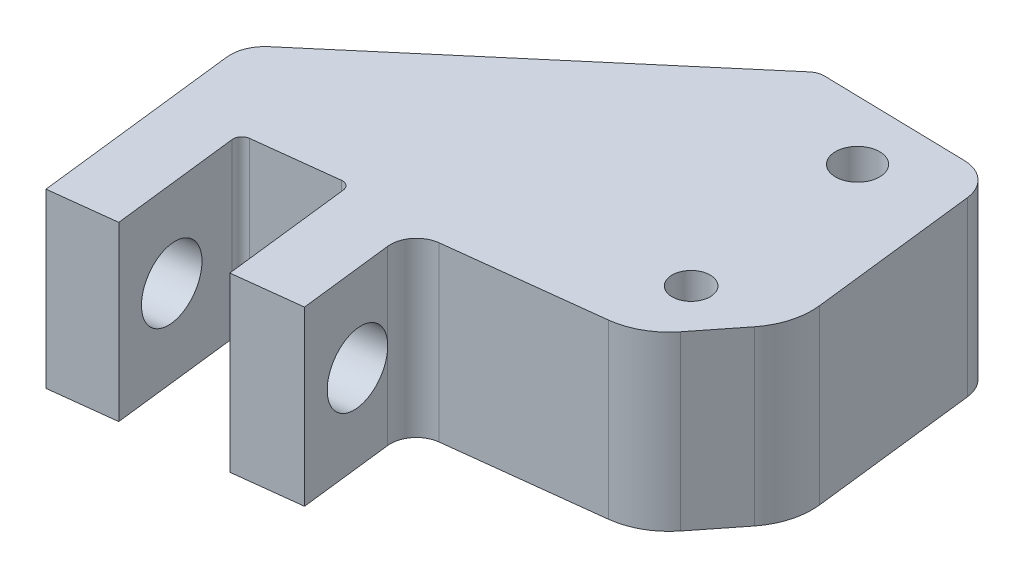
ISO-10303-21;
HEADER;
FILE_DESCRIPTION(('STEP AP214'),'2;1');
FILE_NAME('part.step','',(''),(''),'','','');
FILE_SCHEMA(('AUTOMOTIVE_DESIGN { 1 0 10303 214 1 1 1 1 }'));
ENDSEC;
DATA;
#1=APPLICATION_CONTEXT('core data for automotive mechanical design processes');
#2=APPLICATION_PROTOCOL_DEFINITION('international standard','automotive_design',2000,#1);
#3=PRODUCT_CONTEXT('',#1,'mechanical');
#4=PRODUCT('Part','Part','',(#3));
#5=PRODUCT_RELATED_PRODUCT_CATEGORY('part','',(#4));
#6=PRODUCT_DEFINITION_FORMATION('','',#4);
#7=PRODUCT_DEFINITION_CONTEXT('part definition',#1,'design');
#8=PRODUCT_DEFINITION('design','',#6,#7);
#9=PRODUCT_DEFINITION_SHAPE('','',#8);
#10=(LENGTH_UNIT() NAMED_UNIT(*) SI_UNIT(.MILLI.,.METRE.));
#11=(NAMED_UNIT(*) PLANE_ANGLE_UNIT() SI_UNIT($,.RADIAN.));
#12=(NAMED_UNIT(*) SI_UNIT($,.STERADIAN.) SOLID_ANGLE_UNIT());
#13=UNCERTAINTY_MEASURE_WITH_UNIT(LENGTH_MEASURE(1.E-05),#10,'distance_accuracy_value','');
#14=(GEOMETRIC_REPRESENTATION_CONTEXT(3) GLOBAL_UNCERTAINTY_ASSIGNED_CONTEXT((#13)) GLOBAL_UNIT_ASSIGNED_CONTEXT((#10,
#11,#12)) REPRESENTATION_CONTEXT('',''));
#15=CARTESIAN_POINT('',(0.,0.,0.));
#16=DIRECTION('',(0.,0.,1.));
#17=DIRECTION('',(1.,0.,0.));
#18=AXIS2_PLACEMENT_3D('',#15,#16,#17);
#19=CARTESIAN_POINT('',(0.703399543086181,10.,6.2476591525328));
#20=DIRECTION('',(0.,1.,0.));
#21=DIRECTION('',(0.,0.,1.));
#22=AXIS2_PLACEMENT_3D('',#19,#20,#21);
#23=PLANE('',#22);
#24=CARTESIAN_POINT('',(9.99468971429907,10.,-0.379702838058018));
#25=DIRECTION('',(0.,1.,0.));
#26=DIRECTION('',(0.,0.,1.));
#27=AXIS2_PLACEMENT_3D('',#24,#25,#26);
#28=CIRCLE('',#27,1.1);
#29=CARTESIAN_POINT('',(9.99468971429907,10.,0.720297161941978));
#30=VERTEX_POINT('',#29);
#31=EDGE_CURVE('E224',#30,#30,#28,.T.);
#32=ORIENTED_EDGE('',*,*,#31,.F.);
#33=EDGE_LOOP('',(#32));
#34=FACE_BOUND('',#33,.T.);
#35=DIRECTION('',(0.993193033860848,0.,-0.116480030435627));
#36=VECTOR('',#35,1.);
#37=CARTESIAN_POINT('',(-4.01920267236577,10.,12.3392130031255));
#38=LINE('',#37,#36);
#39=CARTESIAN_POINT('',(-4.01920267236577,10.,12.3392130031255));
#40=VERTEX_POINT('',#39);
#41=CARTESIAN_POINT('',(-0.145749840308469,10.,11.8849408844265));
#42=VERTEX_POINT('',#41);
#43=EDGE_CURVE('E280',#40,#42,#38,.T.);
#44=ORIENTED_EDGE('',*,*,#43,.T.);
#45=DIRECTION('',(-0.116480030435627,0.,-0.993193033860848));
#46=VECTOR('',#45,1.);
#47=CARTESIAN_POINT('',(-0.145749840308469,10.,11.8849408844265));
#48=LINE('',#47,#46);
#49=CARTESIAN_POINT('',(-0.78639000770508,10.,6.42237919818624));
#50=VERTEX_POINT('',#49);
#51=EDGE_CURVE('E138',#42,#50,#48,.T.);
#52=ORIENTED_EDGE('',*,*,#51,.T.);
#53=CARTESIAN_POINT('',(0.703399543086181,10.,6.2476591525328));
#54=DIRECTION('',(0.,-1.,0.));
#55=DIRECTION('',(0.,0.,1.));
#56=AXIS2_PLACEMENT_3D('',#53,#54,#55);
#57=CIRCLE('',#56,1.49999999999999);
#58=CARTESIAN_POINT('',(0.528679497432742,10.,4.75786960174154));
#59=VERTEX_POINT('',#58);
#60=EDGE_CURVE('E380',#50,#59,#57,.T.);
#61=ORIENTED_EDGE('',*,*,#60,.T.);
#62=DIRECTION('',(0.993193033860848,0.,-0.116480030435627));
#63=VECTOR('',#62,1.);
#64=CARTESIAN_POINT('',(0.528679497432741,10.,4.75786960174154));
#65=LINE('',#64,#63);
#66=CARTESIAN_POINT('',(9.31163025425318,10.,3.72781971557571));
#67=VERTEX_POINT('',#66);
#68=EDGE_CURVE('E374',#59,#67,#65,.T.);
#69=ORIENTED_EDGE('',*,*,#68,.T.);
#70=CARTESIAN_POINT('',(8.84571013251067,10.,-0.244952419867645));
#71=DIRECTION('',(0.,1.,0.));
#72=DIRECTION('',(0.,0.,1.));
#73=AXIS2_PLACEMENT_3D('',#70,#71,#72);
#74=CIRCLE('',#73,3.99999999999998);
#75=CARTESIAN_POINT('',(11.9843395271678,10.,2.23476641963702));
#76=VERTEX_POINT('',#75);
#77=EDGE_CURVE('E370',#67,#76,#74,.T.);
#78=ORIENTED_EDGE('',*,*,#77,.T.);
#79=DIRECTION('',(0.619929709876168,0.,-0.784657348664276));
#80=VECTOR('',#79,1.);
#81=CARTESIAN_POINT('',(11.9843395271678,10.,2.23476641963703));
#82=LINE('',#81,#80);
#83=CARTESIAN_POINT('',(13.8752816941912,10.,-0.158636644640111));
#84=VERTEX_POINT('',#83);
#85=EDGE_CURVE('E373',#76,#84,#82,.T.);
#86=ORIENTED_EDGE('',*,*,#85,.T.);
#87=CARTESIAN_POINT('',(10.7366522995341,10.,-2.63835548414479));
#88=DIRECTION('',(0.,1.,0.));
#89=DIRECTION('',(0.,0.,1.));
#90=AXIS2_PLACEMENT_3D('',#87,#88,#89);
#91=CIRCLE('',#90,4.00000000000001);
#92=CARTESIAN_POINT('',(14.7094244349775,10.,-3.1042756058873));
#93=VERTEX_POINT('',#92);
#94=EDGE_CURVE('E378',#84,#93,#91,.T.);
#95=ORIENTED_EDGE('',*,*,#94,.T.);
#96=DIRECTION('',(-0.116480030435627,0.,-0.993193033860848));
#97=VECTOR('',#96,1.);
#98=CARTESIAN_POINT('',(14.7094244349775,10.,-3.1042756058873));
#99=LINE('',#98,#97);
#100=CARTESIAN_POINT('',(13.5695917995988,10.,-12.8233135301688));
#101=VERTEX_POINT('',#100);
#102=EDGE_CURVE('E386',#93,#101,#99,.T.);
#103=ORIENTED_EDGE('',*,*,#102,.T.);
#104=CARTESIAN_POINT('',(11.5832057318771,10.,-12.5903534692975));
#105=DIRECTION('',(0.,1.,0.));
#106=DIRECTION('',(0.,0.,1.));
#107=AXIS2_PLACEMENT_3D('',#104,#105,#106);
#108=CIRCLE('',#107,1.99999999999998);
#109=CARTESIAN_POINT('',(11.6289643310524,10.,-14.5898299384267));
#110=VERTEX_POINT('',#109);
#111=EDGE_CURVE('E389',#101,#110,#108,.T.);
#112=ORIENTED_EDGE('',*,*,#111,.T.);
#113=DIRECTION('',(-0.999738234564618,0.,-0.0228792995876477));
#114=VECTOR('',#113,1.);
#115=CARTESIAN_POINT('',(11.6289643310524,10.,-14.5898299384267));
#116=LINE('',#115,#114);
#117=CARTESIAN_POINT('',(3.34338440745767,10.,-14.7794478391684));
#118=VERTEX_POINT('',#117);
#119=EDGE_CURVE('E392',#110,#118,#116,.T.);
#120=ORIENTED_EDGE('',*,*,#119,.T.);
#121=CARTESIAN_POINT('',(3.32050510787002,10.,-13.7797096046038));
#122=DIRECTION('',(0.,1.,0.));
#123=DIRECTION('',(0.,0.,1.));
#124=AXIS2_PLACEMENT_3D('',#121,#122,#123);
#125=CIRCLE('',#124,1.);
#126=CARTESIAN_POINT('',(2.67266349348918,10.,-14.5414846650228));
#127=VERTEX_POINT('',#126);
#128=EDGE_CURVE('E395',#118,#127,#125,.T.);
#129=ORIENTED_EDGE('',*,*,#128,.T.);
#130=DIRECTION('',(-0.761775060419033,0.,0.647841614380845));
#131=VECTOR('',#130,1.);
#132=CARTESIAN_POINT('',(2.67266349348918,10.,-14.5414846650228));
#133=LINE('',#132,#131);
#134=CARTESIAN_POINT('',(-14.2527169131737,10.,-0.147516765061866));
#135=VERTEX_POINT('',#134);
#136=EDGE_CURVE('E398',#127,#135,#133,.T.);
#137=ORIENTED_EDGE('',*,*,#136,.T.);
#138=CARTESIAN_POINT('',(-12.957033684412,10.,1.37603335577619));
#139=DIRECTION('',(0.,1.,0.));
#140=DIRECTION('',(0.,0.,1.));
#141=AXIS2_PLACEMENT_3D('',#138,#139,#140);
#142=CIRCLE('',#141,1.99999999999999);
#143=CARTESIAN_POINT('',(-14.9434197521337,10.,1.60899341664744));
#144=VERTEX_POINT('',#143);
#145=EDGE_CURVE('E401',#135,#144,#142,.T.);
#146=ORIENTED_EDGE('',*,*,#145,.T.);
#147=DIRECTION('',(0.116480030435628,0.,0.993193033860848));
#148=VECTOR('',#147,1.);
#149=CARTESIAN_POINT('',(-14.9434197521337,10.,1.60899341664744));
#150=LINE('',#149,#148);
#151=CARTESIAN_POINT('',(-13.5538557974252,10.,13.4574212953069));
#152=VERTEX_POINT('',#151);
#153=EDGE_CURVE('E404',#144,#152,#150,.T.);
#154=ORIENTED_EDGE('',*,*,#153,.T.);
#155=DIRECTION('',(0.993193033860848,0.,-0.116480030435627));
#156=VECTOR('',#155,1.);
#157=CARTESIAN_POINT('',(-13.5538557974252,10.,13.4574212953069));
#158=LINE('',#157,#156);
#159=CARTESIAN_POINT('',(-9.77972226875872,10.,13.0147971796521));
#160=VERTEX_POINT('',#159);
#161=EDGE_CURVE('E407',#152,#160,#158,.T.);
#162=ORIENTED_EDGE('',*,*,#161,.T.);
#163=DIRECTION('',(-0.116480030435627,0.,-0.993193033860848));
#164=VECTOR('',#163,1.);
#165=CARTESIAN_POINT('',(-9.77972226875872,10.,13.0147971796521));
#166=LINE('',#165,#164);
#167=CARTESIAN_POINT('',(-10.6533224970266,10.,5.56584942569011));
#168=VERTEX_POINT('',#167);
#169=EDGE_CURVE('E410',#160,#168,#166,.T.);
#170=ORIENTED_EDGE('',*,*,#169,.T.);
#171=CARTESIAN_POINT('',(-10.1567259800961,10.,5.50760941047218));
#172=DIRECTION('',(0.,-1.,0.));
#173=DIRECTION('',(0.,0.,1.));
#174=AXIS2_PLACEMENT_3D('',#171,#172,#173);
#175=CIRCLE('',#174,0.49999999999997);
#176=CARTESIAN_POINT('',(-10.214965995314,10.,5.01101289354179));
#177=VERTEX_POINT('',#176);
#178=EDGE_CURVE('E194',#168,#177,#175,.T.);
#179=ORIENTED_EDGE('',*,*,#178,.T.);
#180=DIRECTION('',(0.993193033860848,0.,-0.116480030435627));
#181=VECTOR('',#180,1.);
#182=CARTESIAN_POINT('',(-10.214965995314,10.,5.01101289354185));
#183=LINE('',#182,#181);
#184=CARTESIAN_POINT('',(-5.4476394327819,10.,4.45190874745084));
#185=VERTEX_POINT('',#184);
#186=EDGE_CURVE('E187',#177,#185,#183,.T.);
#187=ORIENTED_EDGE('',*,*,#186,.T.);
#188=CARTESIAN_POINT('',(-5.38939941756406,10.,4.94850526438125));
#189=DIRECTION('',(0.,-1.,0.));
#190=DIRECTION('',(0.,0.,1.));
#191=AXIS2_PLACEMENT_3D('',#188,#189,#190);
#192=CIRCLE('',#191,0.499999999999988);
#193=CARTESIAN_POINT('',(-4.89280290063364,10.,4.89026524916347));
#194=VERTEX_POINT('',#193);
#195=EDGE_CURVE('E191',#185,#194,#192,.T.);
#196=ORIENTED_EDGE('',*,*,#195,.T.);
#197=DIRECTION('',(0.116480030435628,0.,0.993193033860848));
#198=VECTOR('',#197,1.);
#199=CARTESIAN_POINT('',(-4.89280290063364,10.,4.89026524916347));
#200=LINE('',#199,#198);
#201=EDGE_CURVE('E62',#194,#40,#200,.T.);
#202=ORIENTED_EDGE('',*,*,#201,.T.);
#203=EDGE_LOOP('',(#44,#52,#61,#69,#78,#86,#95,#103,#112,#120,#129,#137,#146,#154,#162,#170,
#179,#187,#196,#202));
#204=FACE_BOUND('',#203,.T.);
#205=CARTESIAN_POINT('',(8.7134093795071,10.,-11.3048262105273));
#206=DIRECTION('',(0.,1.,0.));
#207=DIRECTION('',(0.,0.,1.));
#208=AXIS2_PLACEMENT_3D('',#205,#206,#207);
#209=CIRCLE('',#208,1.27500000000002);
#210=CARTESIAN_POINT('',(8.7134093795071,10.,-10.0298262105273));
#211=VERTEX_POINT('',#210);
#212=EDGE_CURVE('E446',#211,#211,#209,.T.);
#213=ORIENTED_EDGE('',*,*,#212,.F.);
#214=EDGE_LOOP('',(#213));
#215=FACE_BOUND('',#214,.T.);
#216=ADVANCED_FACE('F39',(#34,#204,#215),#23,.T.);
#217=CARTESIAN_POINT('',(0.703399543086181,0.,6.2476591525328));
#218=DIRECTION('',(0.,1.,0.));
#219=DIRECTION('',(0.,0.,1.));
#220=AXIS2_PLACEMENT_3D('',#217,#218,#219);
#221=PLANE('',#220);
#222=DIRECTION('',(0.993193033860848,0.,-0.116480030435627));
#223=VECTOR('',#222,1.);
#224=CARTESIAN_POINT('',(-4.01920267236577,0.,12.3392130031255));
#225=LINE('',#224,#223);
#226=CARTESIAN_POINT('',(-4.01920267236577,0.,12.3392130031255));
#227=VERTEX_POINT('',#226);
#228=CARTESIAN_POINT('',(-0.145749840308469,0.,11.8849408844265));
#229=VERTEX_POINT('',#228);
#230=EDGE_CURVE('E219',#227,#229,#225,.T.);
#231=ORIENTED_EDGE('',*,*,#230,.F.);
#232=DIRECTION('',(0.116480030435628,0.,0.993193033860848));
#233=VECTOR('',#232,1.);
#234=CARTESIAN_POINT('',(-4.89280290063364,0.,4.89026524916347));
#235=LINE('',#234,#233);
#236=CARTESIAN_POINT('',(-4.89280290063364,0.,4.89026524916347));
#237=VERTEX_POINT('',#236);
#238=EDGE_CURVE('E130',#237,#227,#235,.T.);
#239=ORIENTED_EDGE('',*,*,#238,.F.);
#240=CARTESIAN_POINT('',(-5.38939941756406,0.,4.94850526438125));
#241=DIRECTION('',(0.,-1.,0.));
#242=DIRECTION('',(0.,0.,1.));
#243=AXIS2_PLACEMENT_3D('',#240,#241,#242);
#244=CIRCLE('',#243,0.499999999999988);
#245=CARTESIAN_POINT('',(-5.4476394327819,0.,4.45190874745084));
#246=VERTEX_POINT('',#245);
#247=EDGE_CURVE('E275',#246,#237,#244,.T.);
#248=ORIENTED_EDGE('',*,*,#247,.F.);
#249=DIRECTION('',(0.993193033860848,0.,-0.116480030435627));
#250=VECTOR('',#249,1.);
#251=CARTESIAN_POINT('',(-10.214965995314,0.,5.01101289354185));
#252=LINE('',#251,#250);
#253=CARTESIAN_POINT('',(-10.214965995314,0.,5.01101289354179));
#254=VERTEX_POINT('',#253);
#255=EDGE_CURVE('E204',#254,#246,#252,.T.);
#256=ORIENTED_EDGE('',*,*,#255,.F.);
#257=CARTESIAN_POINT('',(-10.1567259800961,0.,5.50760941047218));
#258=DIRECTION('',(0.,-1.,0.));
#259=DIRECTION('',(0.,0.,1.));
#260=AXIS2_PLACEMENT_3D('',#257,#258,#259);
#261=CIRCLE('',#260,0.49999999999997);
#262=CARTESIAN_POINT('',(-10.6533224970266,0.,5.56584942569011));
#263=VERTEX_POINT('',#262);
#264=EDGE_CURVE('E270',#263,#254,#261,.T.);
#265=ORIENTED_EDGE('',*,*,#264,.F.);
#266=DIRECTION('',(-0.116480030435627,0.,-0.993193033860848));
#267=VECTOR('',#266,1.);
#268=CARTESIAN_POINT('',(-9.77972226875872,0.,13.0147971796521));
#269=LINE('',#268,#267);
#270=CARTESIAN_POINT('',(-9.77972226875872,0.,13.0147971796521));
#271=VERTEX_POINT('',#270);
#272=EDGE_CURVE('E267',#271,#263,#269,.T.);
#273=ORIENTED_EDGE('',*,*,#272,.F.);
#274=DIRECTION('',(0.993193033860848,0.,-0.116480030435627));
#275=VECTOR('',#274,1.);
#276=CARTESIAN_POINT('',(-13.5538557974252,0.,13.4574212953069));
#277=LINE('',#276,#275);
#278=CARTESIAN_POINT('',(-13.5538557974252,0.,13.4574212953069));
#279=VERTEX_POINT('',#278);
#280=EDGE_CURVE('E264',#279,#271,#277,.T.);
#281=ORIENTED_EDGE('',*,*,#280,.F.);
#282=DIRECTION('',(0.116480030435628,0.,0.993193033860848));
#283=VECTOR('',#282,1.);
#284=CARTESIAN_POINT('',(-14.9434197521337,0.,1.60899341664744));
#285=LINE('',#284,#283);
#286=CARTESIAN_POINT('',(-14.9434197521337,0.,1.60899341664744));
#287=VERTEX_POINT('',#286);
#288=EDGE_CURVE('E261',#287,#279,#285,.T.);
#289=ORIENTED_EDGE('',*,*,#288,.F.);
#290=CARTESIAN_POINT('',(-12.957033684412,0.,1.37603335577619));
#291=DIRECTION('',(0.,1.,0.));
#292=DIRECTION('',(0.,0.,1.));
#293=AXIS2_PLACEMENT_3D('',#290,#291,#292);
#294=CIRCLE('',#293,1.99999999999999);
#295=CARTESIAN_POINT('',(-14.2527169131737,0.,-0.147516765061866));
#296=VERTEX_POINT('',#295);
#297=EDGE_CURVE('E258',#296,#287,#294,.T.);
#298=ORIENTED_EDGE('',*,*,#297,.F.);
#299=DIRECTION('',(-0.761775060419033,0.,0.647841614380845));
#300=VECTOR('',#299,1.);
#301=CARTESIAN_POINT('',(2.67266349348918,0.,-14.5414846650228));
#302=LINE('',#301,#300);
#303=CARTESIAN_POINT('',(2.67266349348918,0.,-14.5414846650228));
#304=VERTEX_POINT('',#303);
#305=EDGE_CURVE('E255',#304,#296,#302,.T.);
#306=ORIENTED_EDGE('',*,*,#305,.F.);
#307=CARTESIAN_POINT('',(3.32050510787002,0.,-13.7797096046038));
#308=DIRECTION('',(0.,1.,0.));
#309=DIRECTION('',(0.,0.,1.));
#310=AXIS2_PLACEMENT_3D('',#307,#308,#309);
#311=CIRCLE('',#310,1.);
#312=CARTESIAN_POINT('',(3.34338440745767,0.,-14.7794478391684));
#313=VERTEX_POINT('',#312);
#314=EDGE_CURVE('E252',#313,#304,#311,.T.);
#315=ORIENTED_EDGE('',*,*,#314,.F.);
#316=DIRECTION('',(-0.999738234564618,0.,-0.0228792995876477));
#317=VECTOR('',#316,1.);
#318=CARTESIAN_POINT('',(11.6289643310524,0.,-14.5898299384267));
#319=LINE('',#318,#317);
#320=CARTESIAN_POINT('',(11.6289643310524,0.,-14.5898299384267));
#321=VERTEX_POINT('',#320);
#322=EDGE_CURVE('E249',#321,#313,#319,.T.);
#323=ORIENTED_EDGE('',*,*,#322,.F.);
#324=CARTESIAN_POINT('',(11.5832057318771,0.,-12.5903534692975));
#325=DIRECTION('',(0.,1.,0.));
#326=DIRECTION('',(0.,0.,1.));
#327=AXIS2_PLACEMENT_3D('',#324,#325,#326);
#328=CIRCLE('',#327,1.99999999999998);
#329=CARTESIAN_POINT('',(13.5695917995988,0.,-12.8233135301688));
#330=VERTEX_POINT('',#329);
#331=EDGE_CURVE('E246',#330,#321,#328,.T.);
#332=ORIENTED_EDGE('',*,*,#331,.F.);
#333=DIRECTION('',(-0.116480030435627,0.,-0.993193033860848));
#334=VECTOR('',#333,1.);
#335=CARTESIAN_POINT('',(14.7094244349775,0.,-3.1042756058873));
#336=LINE('',#335,#334);
#337=CARTESIAN_POINT('',(14.7094244349775,0.,-3.1042756058873));
#338=VERTEX_POINT('',#337);
#339=EDGE_CURVE('E243',#338,#330,#336,.T.);
#340=ORIENTED_EDGE('',*,*,#339,.F.);
#341=CARTESIAN_POINT('',(10.7366522995341,0.,-2.63835548414479));
#342=DIRECTION('',(0.,1.,0.));
#343=DIRECTION('',(0.,0.,1.));
#344=AXIS2_PLACEMENT_3D('',#341,#342,#343);
#345=CIRCLE('',#344,4.00000000000001);
#346=CARTESIAN_POINT('',(13.8752816941912,0.,-0.158636644640111));
#347=VERTEX_POINT('',#346);
#348=EDGE_CURVE('E240',#347,#338,#345,.T.);
#349=ORIENTED_EDGE('',*,*,#348,.F.);
#350=DIRECTION('',(0.619929709876168,0.,-0.784657348664276));
#351=VECTOR('',#350,1.);
#352=CARTESIAN_POINT('',(11.9843395271678,0.,2.23476641963703));
#353=LINE('',#352,#351);
#354=CARTESIAN_POINT('',(11.9843395271678,0.,2.23476641963702));
#355=VERTEX_POINT('',#354);
#356=EDGE_CURVE('E237',#355,#347,#353,.T.);
#357=ORIENTED_EDGE('',*,*,#356,.F.);
#358=CARTESIAN_POINT('',(8.84571013251067,0.,-0.244952419867645));
#359=DIRECTION('',(0.,1.,0.));
#360=DIRECTION('',(0.,0.,1.));
#361=AXIS2_PLACEMENT_3D('',#358,#359,#360);
#362=CIRCLE('',#361,3.99999999999998);
#363=CARTESIAN_POINT('',(9.31163025425318,0.,3.72781971557571));
#364=VERTEX_POINT('',#363);
#365=EDGE_CURVE('E234',#364,#355,#362,.T.);
#366=ORIENTED_EDGE('',*,*,#365,.F.);
#367=DIRECTION('',(0.993193033860848,0.,-0.116480030435627));
#368=VECTOR('',#367,1.);
#369=CARTESIAN_POINT('',(0.528679497432741,0.,4.75786960174154));
#370=LINE('',#369,#368);
#371=CARTESIAN_POINT('',(0.528679497432742,0.,4.75786960174154));
#372=VERTEX_POINT('',#371);
#373=EDGE_CURVE('E231',#372,#364,#370,.T.);
#374=ORIENTED_EDGE('',*,*,#373,.F.);
#375=CARTESIAN_POINT('',(0.703399543086181,0.,6.2476591525328));
#376=DIRECTION('',(0.,-1.,0.));
#377=DIRECTION('',(0.,0.,1.));
#378=AXIS2_PLACEMENT_3D('',#375,#376,#377);
#379=CIRCLE('',#378,1.49999999999999);
#380=CARTESIAN_POINT('',(-0.78639000770508,0.,6.42237919818624));
#381=VERTEX_POINT('',#380);
#382=EDGE_CURVE('E228',#381,#372,#379,.T.);
#383=ORIENTED_EDGE('',*,*,#382,.F.);
#384=DIRECTION('',(-0.116480030435627,0.,-0.993193033860848));
#385=VECTOR('',#384,1.);
#386=CARTESIAN_POINT('',(-0.145749840308469,0.,11.8849408844265));
#387=LINE('',#386,#385);
#388=EDGE_CURVE('E223',#229,#381,#387,.T.);
#389=ORIENTED_EDGE('',*,*,#388,.F.);
#390=EDGE_LOOP('',(#231,#239,#248,#256,#265,#273,#281,#289,#298,#306,#315,#323,#332,#340,#349,
#357,#366,#374,#383,#389));
#391=FACE_BOUND('',#390,.T.);
#392=CARTESIAN_POINT('',(9.99468971429907,0.,-0.379702838058018));
#393=DIRECTION('',(0.,1.,0.));
#394=DIRECTION('',(0.,0.,1.));
#395=AXIS2_PLACEMENT_3D('',#392,#393,#394);
#396=CIRCLE('',#395,1.1);
#397=CARTESIAN_POINT('',(9.99468971429907,0.,0.720297161941978));
#398=VERTEX_POINT('',#397);
#399=EDGE_CURVE('E431',#398,#398,#396,.T.);
#400=ORIENTED_EDGE('',*,*,#399,.T.);
#401=EDGE_LOOP('',(#400));
#402=FACE_BOUND('',#401,.T.);
#403=CARTESIAN_POINT('',(8.7134093795071,0.,-11.3048262105273));
#404=DIRECTION('',(0.,1.,0.));
#405=DIRECTION('',(0.,0.,1.));
#406=AXIS2_PLACEMENT_3D('',#403,#404,#405);
#407=CIRCLE('',#406,1.27500000000002);
#408=CARTESIAN_POINT('',(8.7134093795071,0.,-10.0298262105273));
#409=VERTEX_POINT('',#408);
#410=EDGE_CURVE('E445',#409,#409,#407,.T.);
#411=ORIENTED_EDGE('',*,*,#410,.T.);
#412=EDGE_LOOP('',(#411));
#413=FACE_BOUND('',#412,.T.);
#414=ADVANCED_FACE('F358',(#391,#402,#413),#221,.F.);
#415=CARTESIAN_POINT('',(-4.01920267236577,10.,12.3392130031255));
#416=DIRECTION('',(-0.116480030435627,0.,-0.993193033860848));
#417=DIRECTION('',(-0.993193033860848,0.,0.116480030435627));
#418=AXIS2_PLACEMENT_3D('',#415,#416,#417);
#419=PLANE('',#418);
#420=ORIENTED_EDGE('',*,*,#230,.T.);
#421=DIRECTION('',(0.,-1.,0.));
#422=VECTOR('',#421,1.);
#423=CARTESIAN_POINT('',(-0.145749840308469,10.,11.8849408844265));
#424=LINE('',#423,#422);
#425=EDGE_CURVE('E11',#42,#229,#424,.T.);
#426=ORIENTED_EDGE('',*,*,#425,.F.);
#427=ORIENTED_EDGE('',*,*,#43,.F.);
#428=DIRECTION('',(0.,-1.,0.));
#429=VECTOR('',#428,1.);
#430=CARTESIAN_POINT('',(-4.01920267236577,10.,12.3392130031255));
#431=LINE('',#430,#429);
#432=EDGE_CURVE('E215',#40,#227,#431,.T.);
#433=ORIENTED_EDGE('',*,*,#432,.T.);
#434=EDGE_LOOP('',(#420,#426,#427,#433));
#435=FACE_BOUND('',#434,.T.);
#436=ADVANCED_FACE('F41',(#435),#419,.F.);
#437=CARTESIAN_POINT('',(-0.145749840308469,10.,11.8849408844265));
#438=DIRECTION('',(-0.993193033860848,0.,0.116480030435627));
#439=DIRECTION('',(0.116480030435627,0.,0.993193033860848));
#440=AXIS2_PLACEMENT_3D('',#437,#438,#439);
#441=PLANE('',#440);
#442=DIRECTION('',(0.,-1.,0.));
#443=VECTOR('',#442,1.);
#444=CARTESIAN_POINT('',(-0.78639000770508,10.,6.42237919818624));
#445=LINE('',#444,#443);
#446=CARTESIAN_POINT('',(-0.78639000770508,5.,6.42237919818624));
#447=VERTEX_POINT('',#446);
#448=EDGE_CURVE('E343',#447,#381,#445,.T.);
#449=ORIENTED_EDGE('',*,*,#448,.F.);
#450=CARTESIAN_POINT('',(-0.553429946833495,5.,8.40876526591075));
#451=DIRECTION('',(0.993193033860848,0.,-0.116480030435627));
#452=DIRECTION('',(-0.116480030435627,0.,-0.993193033860848));
#453=AXIS2_PLACEMENT_3D('',#450,#451,#452);
#454=CIRCLE('',#453,2.);
#455=EDGE_CURVE('E54',#447,#447,#454,.T.);
#456=ORIENTED_EDGE('',*,*,#455,.F.);
#457=EDGE_CURVE('E49',#50,#447,#445,.T.);
#458=ORIENTED_EDGE('',*,*,#457,.F.);
#459=ORIENTED_EDGE('',*,*,#51,.F.);
#460=ORIENTED_EDGE('',*,*,#425,.T.);
#461=ORIENTED_EDGE('',*,*,#388,.T.);
#462=EDGE_LOOP('',(#449,#456,#458,#459,#460,#461));
#463=FACE_BOUND('',#462,.T.);
#464=ADVANCED_FACE('F353',(#463),#441,.F.);
#465=CARTESIAN_POINT('',(0.703399543086181,10.,6.2476591525328));
#466=DIRECTION('',(0.,-1.,0.));
#467=DIRECTION('',(0.,0.,-1.));
#468=AXIS2_PLACEMENT_3D('',#465,#466,#467);
#469=CYLINDRICAL_SURFACE('',#468,1.49999999999999);
#470=ORIENTED_EDGE('',*,*,#382,.T.);
#471=DIRECTION('',(0.,-1.,0.));
#472=VECTOR('',#471,1.);
#473=CARTESIAN_POINT('',(0.528679497432742,10.,4.75786960174154));
#474=LINE('',#473,#472);
#475=EDGE_CURVE('E339',#59,#372,#474,.T.);
#476=ORIENTED_EDGE('',*,*,#475,.F.);
#477=ORIENTED_EDGE('',*,*,#60,.F.);
#478=ORIENTED_EDGE('',*,*,#457,.T.);
#479=ORIENTED_EDGE('',*,*,#448,.T.);
#480=EDGE_LOOP('',(#470,#476,#477,#478,#479));
#481=FACE_BOUND('',#480,.T.);
#482=ADVANCED_FACE('F350',(#481),#469,.F.);
#483=CARTESIAN_POINT('',(0.528679497432741,10.,4.75786960174154));
#484=DIRECTION('',(-0.116480030435627,0.,-0.993193033860848));
#485=DIRECTION('',(-0.993193033860848,0.,0.116480030435627));
#486=AXIS2_PLACEMENT_3D('',#483,#484,#485);
#487=PLANE('',#486);
#488=ORIENTED_EDGE('',*,*,#373,.T.);
#489=DIRECTION('',(0.,-1.,0.));
#490=VECTOR('',#489,1.);
#491=CARTESIAN_POINT('',(9.31163025425318,10.,3.72781971557571));
#492=LINE('',#491,#490);
#493=EDGE_CURVE('E335',#67,#364,#492,.T.);
#494=ORIENTED_EDGE('',*,*,#493,.F.);
#495=ORIENTED_EDGE('',*,*,#68,.F.);
#496=ORIENTED_EDGE('',*,*,#475,.T.);
#497=EDGE_LOOP('',(#488,#494,#495,#496));
#498=FACE_BOUND('',#497,.T.);
#499=ADVANCED_FACE('F364',(#498),#487,.F.);
#500=CARTESIAN_POINT('',(8.84571013251067,10.,-0.244952419867645));
#501=DIRECTION('',(0.,-1.,0.));
#502=DIRECTION('',(0.,0.,-1.));
#503=AXIS2_PLACEMENT_3D('',#500,#501,#502);
#504=CYLINDRICAL_SURFACE('',#503,3.99999999999998);
#505=ORIENTED_EDGE('',*,*,#365,.T.);
#506=DIRECTION('',(0.,-1.,0.));
#507=VECTOR('',#506,1.);
#508=CARTESIAN_POINT('',(11.9843395271678,10.,2.23476641963702));
#509=LINE('',#508,#507);
#510=EDGE_CURVE('E331',#76,#355,#509,.T.);
#511=ORIENTED_EDGE('',*,*,#510,.F.);
#512=ORIENTED_EDGE('',*,*,#77,.F.);
#513=ORIENTED_EDGE('',*,*,#493,.T.);
#514=EDGE_LOOP('',(#505,#511,#512,#513));
#515=FACE_BOUND('',#514,.T.);
#516=ADVANCED_FACE('F368',(#515),#504,.T.);
#517=CARTESIAN_POINT('',(11.9843395271678,10.,2.23476641963703));
#518=DIRECTION('',(-0.784657348664276,0.,-0.619929709876168));
#519=DIRECTION('',(-0.619929709876168,0.,0.784657348664276));
#520=AXIS2_PLACEMENT_3D('',#517,#518,#519);
#521=PLANE('',#520);
#522=ORIENTED_EDGE('',*,*,#356,.T.);
#523=DIRECTION('',(0.,-1.,0.));
#524=VECTOR('',#523,1.);
#525=CARTESIAN_POINT('',(13.8752816941912,10.,-0.158636644640111));
#526=LINE('',#525,#524);
#527=EDGE_CURVE('E327',#84,#347,#526,.T.);
#528=ORIENTED_EDGE('',*,*,#527,.F.);
#529=ORIENTED_EDGE('',*,*,#85,.F.);
#530=ORIENTED_EDGE('',*,*,#510,.T.);
#531=EDGE_LOOP('',(#522,#528,#529,#530));
#532=FACE_BOUND('',#531,.T.);
#533=ADVANCED_FACE('F526',(#532),#521,.F.);
#534=CARTESIAN_POINT('',(10.7366522995341,10.,-2.63835548414479));
#535=DIRECTION('',(0.,-1.,0.));
#536=DIRECTION('',(0.,0.,-1.));
#537=AXIS2_PLACEMENT_3D('',#534,#535,#536);
#538=CYLINDRICAL_SURFACE('',#537,4.00000000000001);
#539=ORIENTED_EDGE('',*,*,#348,.T.);
#540=DIRECTION('',(0.,-1.,0.));
#541=VECTOR('',#540,1.);
#542=CARTESIAN_POINT('',(14.7094244349775,10.,-3.1042756058873));
#543=LINE('',#542,#541);
#544=EDGE_CURVE('E323',#93,#338,#543,.T.);
#545=ORIENTED_EDGE('',*,*,#544,.F.);
#546=ORIENTED_EDGE('',*,*,#94,.F.);
#547=ORIENTED_EDGE('',*,*,#527,.T.);
#548=EDGE_LOOP('',(#539,#545,#546,#547));
#549=FACE_BOUND('',#548,.T.);
#550=ADVANCED_FACE('F522',(#549),#538,.T.);
#551=CARTESIAN_POINT('',(14.7094244349775,10.,-3.1042756058873));
#552=DIRECTION('',(-0.993193033860848,0.,0.116480030435627));
#553=DIRECTION('',(0.116480030435627,0.,0.993193033860848));
#554=AXIS2_PLACEMENT_3D('',#551,#552,#553);
#555=PLANE('',#554);
#556=ORIENTED_EDGE('',*,*,#339,.T.);
#557=DIRECTION('',(0.,-1.,0.));
#558=VECTOR('',#557,1.);
#559=CARTESIAN_POINT('',(13.5695917995988,10.,-12.8233135301688));
#560=LINE('',#559,#558);
#561=EDGE_CURVE('E319',#101,#330,#560,.T.);
#562=ORIENTED_EDGE('',*,*,#561,.F.);
#563=ORIENTED_EDGE('',*,*,#102,.F.);
#564=ORIENTED_EDGE('',*,*,#544,.T.);
#565=EDGE_LOOP('',(#556,#562,#563,#564));
#566=FACE_BOUND('',#565,.T.);
#567=ADVANCED_FACE('F518',(#566),#555,.F.);
#568=CARTESIAN_POINT('',(11.5832057318771,10.,-12.5903534692975));
#569=DIRECTION('',(0.,-1.,0.));
#570=DIRECTION('',(0.,0.,-1.));
#571=AXIS2_PLACEMENT_3D('',#568,#569,#570);
#572=CYLINDRICAL_SURFACE('',#571,1.99999999999998);
#573=ORIENTED_EDGE('',*,*,#331,.T.);
#574=DIRECTION('',(0.,-1.,0.));
#575=VECTOR('',#574,1.);
#576=CARTESIAN_POINT('',(11.6289643310524,10.,-14.5898299384267));
#577=LINE('',#576,#575);
#578=EDGE_CURVE('E315',#110,#321,#577,.T.);
#579=ORIENTED_EDGE('',*,*,#578,.F.);
#580=ORIENTED_EDGE('',*,*,#111,.F.);
#581=ORIENTED_EDGE('',*,*,#561,.T.);
#582=EDGE_LOOP('',(#573,#579,#580,#581));
#583=FACE_BOUND('',#582,.T.);
#584=ADVANCED_FACE('F514',(#583),#572,.T.);
#585=CARTESIAN_POINT('',(11.6289643310524,10.,-14.5898299384267));
#586=DIRECTION('',(-0.0228792995876478,0.,0.999738234564618));
#587=DIRECTION('',(0.999738234564618,0.,0.0228792995876478));
#588=AXIS2_PLACEMENT_3D('',#585,#586,#587);
#589=PLANE('',#588);
#590=ORIENTED_EDGE('',*,*,#322,.T.);
#591=DIRECTION('',(0.,-1.,0.));
#592=VECTOR('',#591,1.);
#593=CARTESIAN_POINT('',(3.34338440745767,10.,-14.7794478391684));
#594=LINE('',#593,#592);
#595=EDGE_CURVE('E311',#118,#313,#594,.T.);
#596=ORIENTED_EDGE('',*,*,#595,.F.);
#597=ORIENTED_EDGE('',*,*,#119,.F.);
#598=ORIENTED_EDGE('',*,*,#578,.T.);
#599=EDGE_LOOP('',(#590,#596,#597,#598));
#600=FACE_BOUND('',#599,.T.);
#601=ADVANCED_FACE('F510',(#600),#589,.F.);
#602=CARTESIAN_POINT('',(3.32050510787002,10.,-13.7797096046038));
#603=DIRECTION('',(0.,-1.,0.));
#604=DIRECTION('',(0.,0.,-1.));
#605=AXIS2_PLACEMENT_3D('',#602,#603,#604);
#606=CYLINDRICAL_SURFACE('',#605,1.);
#607=ORIENTED_EDGE('',*,*,#314,.T.);
#608=DIRECTION('',(0.,-1.,0.));
#609=VECTOR('',#608,1.);
#610=CARTESIAN_POINT('',(2.67266349348918,10.,-14.5414846650228));
#611=LINE('',#610,#609);
#612=EDGE_CURVE('E307',#127,#304,#611,.T.);
#613=ORIENTED_EDGE('',*,*,#612,.F.);
#614=ORIENTED_EDGE('',*,*,#128,.F.);
#615=ORIENTED_EDGE('',*,*,#595,.T.);
#616=EDGE_LOOP('',(#607,#613,#614,#615));
#617=FACE_BOUND('',#616,.T.);
#618=ADVANCED_FACE('F506',(#617),#606,.T.);
#619=CARTESIAN_POINT('',(2.67266349348918,10.,-14.5414846650228));
#620=DIRECTION('',(0.647841614380845,0.,0.761775060419033));
#621=DIRECTION('',(0.761775060419033,0.,-0.647841614380845));
#622=AXIS2_PLACEMENT_3D('',#619,#620,#621);
#623=PLANE('',#622);
#624=ORIENTED_EDGE('',*,*,#305,.T.);
#625=DIRECTION('',(0.,-1.,0.));
#626=VECTOR('',#625,1.);
#627=CARTESIAN_POINT('',(-14.2527169131737,10.,-0.147516765061866));
#628=LINE('',#627,#626);
#629=EDGE_CURVE('E303',#135,#296,#628,.T.);
#630=ORIENTED_EDGE('',*,*,#629,.F.);
#631=ORIENTED_EDGE('',*,*,#136,.F.);
#632=ORIENTED_EDGE('',*,*,#612,.T.);
#633=EDGE_LOOP('',(#624,#630,#631,#632));
#634=FACE_BOUND('',#633,.T.);
#635=ADVANCED_FACE('F502',(#634),#623,.F.);
#636=CARTESIAN_POINT('',(-12.957033684412,10.,1.37603335577619));
#637=DIRECTION('',(0.,-1.,0.));
#638=DIRECTION('',(0.,0.,-1.));
#639=AXIS2_PLACEMENT_3D('',#636,#637,#638);
#640=CYLINDRICAL_SURFACE('',#639,1.99999999999999);
#641=ORIENTED_EDGE('',*,*,#297,.T.);
#642=DIRECTION('',(0.,-1.,0.));
#643=VECTOR('',#642,1.);
#644=CARTESIAN_POINT('',(-14.9434197521337,10.,1.60899341664744));
#645=LINE('',#644,#643);
#646=EDGE_CURVE('E299',#144,#287,#645,.T.);
#647=ORIENTED_EDGE('',*,*,#646,.F.);
#648=ORIENTED_EDGE('',*,*,#145,.F.);
#649=ORIENTED_EDGE('',*,*,#629,.T.);
#650=EDGE_LOOP('',(#641,#647,#648,#649));
#651=FACE_BOUND('',#650,.T.);
#652=ADVANCED_FACE('F498',(#651),#640,.T.);
#653=CARTESIAN_POINT('',(-14.9434197521337,10.,1.60899341664744));
#654=DIRECTION('',(0.993193033860848,0.,-0.116480030435628));
#655=DIRECTION('',(-0.116480030435628,0.,-0.993193033860848));
#656=AXIS2_PLACEMENT_3D('',#653,#654,#655);
#657=PLANE('',#656);
#658=CARTESIAN_POINT('',(-13.9615359039502,5.,9.98124567679117));
#659=DIRECTION('',(0.993193033860848,0.,-0.116480030435628));
#660=DIRECTION('',(-0.116480030435628,0.,-0.993193033860848));
#661=AXIS2_PLACEMENT_3D('',#658,#659,#660);
#662=CIRCLE('',#661,2.);
#663=CARTESIAN_POINT('',(-14.1944959648215,5.,7.99485960906947));
#664=VERTEX_POINT('',#663);
#665=EDGE_CURVE('E435',#664,#664,#662,.F.);
#666=ORIENTED_EDGE('',*,*,#665,.F.);
#667=EDGE_LOOP('',(#666));
#668=FACE_BOUND('',#667,.T.);
#669=ORIENTED_EDGE('',*,*,#288,.T.);
#670=DIRECTION('',(0.,-1.,0.));
#671=VECTOR('',#670,1.);
#672=CARTESIAN_POINT('',(-13.5538557974252,10.,13.4574212953069));
#673=LINE('',#672,#671);
#674=EDGE_CURVE('E295',#152,#279,#673,.T.);
#675=ORIENTED_EDGE('',*,*,#674,.F.);
#676=ORIENTED_EDGE('',*,*,#153,.F.);
#677=ORIENTED_EDGE('',*,*,#646,.T.);
#678=EDGE_LOOP('',(#669,#675,#676,#677));
#679=FACE_BOUND('',#678,.T.);
#680=ADVANCED_FACE('F494',(#668,#679),#657,.F.);
#681=CARTESIAN_POINT('',(-13.5538557974252,10.,13.4574212953069));
#682=DIRECTION('',(-0.116480030435627,0.,-0.993193033860848));
#683=DIRECTION('',(-0.993193033860848,0.,0.116480030435627));
#684=AXIS2_PLACEMENT_3D('',#681,#682,#683);
#685=PLANE('',#684);
#686=ORIENTED_EDGE('',*,*,#280,.T.);
#687=DIRECTION('',(0.,-1.,0.));
#688=VECTOR('',#687,1.);
#689=CARTESIAN_POINT('',(-9.77972226875872,10.,13.0147971796521));
#690=LINE('',#689,#688);
#691=EDGE_CURVE('E291',#160,#271,#690,.T.);
#692=ORIENTED_EDGE('',*,*,#691,.F.);
#693=ORIENTED_EDGE('',*,*,#161,.F.);
#694=ORIENTED_EDGE('',*,*,#674,.T.);
#695=EDGE_LOOP('',(#686,#692,#693,#694));
#696=FACE_BOUND('',#695,.T.);
#697=ADVANCED_FACE('F490',(#696),#685,.F.);
#698=CARTESIAN_POINT('',(-9.77972226875872,10.,13.0147971796521));
#699=DIRECTION('',(-0.993193033860848,0.,0.116480030435627));
#700=DIRECTION('',(0.116480030435627,0.,0.993193033860848));
#701=AXIS2_PLACEMENT_3D('',#698,#699,#700);
#702=PLANE('',#701);
#703=CARTESIAN_POINT('',(-10.1874023752837,5.,9.53862156113634));
#704=DIRECTION('',(-0.993193033860848,0.,0.116480030435627));
#705=DIRECTION('',(0.116480030435627,0.,0.993193033860848));
#706=AXIS2_PLACEMENT_3D('',#703,#704,#705);
#707=CIRCLE('',#706,2.);
#708=CARTESIAN_POINT('',(-10.420362436155,5.,7.55223549341465));
#709=VERTEX_POINT('',#708);
#710=EDGE_CURVE('E441',#709,#709,#707,.T.);
#711=ORIENTED_EDGE('',*,*,#710,.T.);
#712=EDGE_LOOP('',(#711));
#713=FACE_BOUND('',#712,.T.);
#714=ORIENTED_EDGE('',*,*,#272,.T.);
#715=DIRECTION('',(0.,-1.,0.));
#716=VECTOR('',#715,1.);
#717=CARTESIAN_POINT('',(-10.6533224970266,10.,5.56584942569011));
#718=LINE('',#717,#716);
#719=EDGE_CURVE('E287',#168,#263,#718,.T.);
#720=ORIENTED_EDGE('',*,*,#719,.F.);
#721=ORIENTED_EDGE('',*,*,#169,.F.);
#722=ORIENTED_EDGE('',*,*,#691,.T.);
#723=EDGE_LOOP('',(#714,#720,#721,#722));
#724=FACE_BOUND('',#723,.T.);
#725=ADVANCED_FACE('F418',(#713,#724),#702,.F.);
#726=CARTESIAN_POINT('',(-10.1567259800961,10.,5.50760941047218));
#727=DIRECTION('',(0.,-1.,0.));
#728=DIRECTION('',(0.,0.,-1.));
#729=AXIS2_PLACEMENT_3D('',#726,#727,#728);
#730=CYLINDRICAL_SURFACE('',#729,0.49999999999997);
#731=ORIENTED_EDGE('',*,*,#264,.T.);
#732=DIRECTION('',(0.,-1.,0.));
#733=VECTOR('',#732,1.);
#734=CARTESIAN_POINT('',(-10.214965995314,10.,5.01101289354179));
#735=LINE('',#734,#733);
#736=EDGE_CURVE('E208',#177,#254,#735,.T.);
#737=ORIENTED_EDGE('',*,*,#736,.F.);
#738=ORIENTED_EDGE('',*,*,#178,.F.);
#739=ORIENTED_EDGE('',*,*,#719,.T.);
#740=EDGE_LOOP('',(#731,#737,#738,#739));
#741=FACE_BOUND('',#740,.T.);
#742=ADVANCED_FACE('F422',(#741),#730,.F.);
#743=CARTESIAN_POINT('',(-10.214965995314,10.,5.01101289354185));
#744=DIRECTION('',(-0.116480030435627,0.,-0.993193033860848));
#745=DIRECTION('',(-0.993193033860848,0.,0.116480030435627));
#746=AXIS2_PLACEMENT_3D('',#743,#744,#745);
#747=PLANE('',#746);
#748=ORIENTED_EDGE('',*,*,#255,.T.);
#749=DIRECTION('',(0.,-1.,0.));
#750=VECTOR('',#749,1.);
#751=CARTESIAN_POINT('',(-5.4476394327819,10.,4.45190874745084));
#752=LINE('',#751,#750);
#753=EDGE_CURVE('E201',#185,#246,#752,.T.);
#754=ORIENTED_EDGE('',*,*,#753,.F.);
#755=ORIENTED_EDGE('',*,*,#186,.F.);
#756=ORIENTED_EDGE('',*,*,#736,.T.);
#757=EDGE_LOOP('',(#748,#754,#755,#756));
#758=FACE_BOUND('',#757,.T.);
#759=ADVANCED_FACE('F202',(#758),#747,.F.);
#760=CARTESIAN_POINT('',(-5.38939941756406,10.,4.94850526438125));
#761=DIRECTION('',(0.,-1.,0.));
#762=DIRECTION('',(0.,0.,-1.));
#763=AXIS2_PLACEMENT_3D('',#760,#761,#762);
#764=CYLINDRICAL_SURFACE('',#763,0.499999999999988);
#765=ORIENTED_EDGE('',*,*,#247,.T.);
#766=DIRECTION('',(0.,-1.,0.));
#767=VECTOR('',#766,1.);
#768=CARTESIAN_POINT('',(-4.89280290063364,10.,4.89026524916347));
#769=LINE('',#768,#767);
#770=EDGE_CURVE('E209',#194,#237,#769,.T.);
#771=ORIENTED_EDGE('',*,*,#770,.F.);
#772=ORIENTED_EDGE('',*,*,#195,.F.);
#773=ORIENTED_EDGE('',*,*,#753,.T.);
#774=EDGE_LOOP('',(#765,#771,#772,#773));
#775=FACE_BOUND('',#774,.T.);
#776=ADVANCED_FACE('F211',(#775),#764,.F.);
#777=CARTESIAN_POINT('',(-4.89280290063364,10.,4.89026524916347));
#778=DIRECTION('',(0.993193033860848,0.,-0.116480030435628));
#779=DIRECTION('',(-0.116480030435628,0.,-0.993193033860848));
#780=AXIS2_PLACEMENT_3D('',#777,#778,#779);
#781=PLANE('',#780);
#782=CARTESIAN_POINT('',(-4.42688277889079,5.,8.8630373846097));
#783=DIRECTION('',(0.993193033860848,0.,-0.116480030435628));
#784=DIRECTION('',(-0.116480030435628,0.,-0.993193033860848));
#785=AXIS2_PLACEMENT_3D('',#782,#783,#784);
#786=CIRCLE('',#785,2.);
#787=CARTESIAN_POINT('',(-4.65984283976205,5.,6.876651316888));
#788=VERTEX_POINT('',#787);
#789=EDGE_CURVE('E43',#788,#788,#786,.T.);
#790=ORIENTED_EDGE('',*,*,#789,.T.);
#791=EDGE_LOOP('',(#790));
#792=FACE_BOUND('',#791,.T.);
#793=ORIENTED_EDGE('',*,*,#238,.T.);
#794=ORIENTED_EDGE('',*,*,#432,.F.);
#795=ORIENTED_EDGE('',*,*,#201,.F.);
#796=ORIENTED_EDGE('',*,*,#770,.T.);
#797=EDGE_LOOP('',(#793,#794,#795,#796));
#798=FACE_BOUND('',#797,.T.);
#799=ADVANCED_FACE('F423',(#792,#798),#781,.F.);
#800=CARTESIAN_POINT('',(9.99468971429907,10.,-0.379702838058018));
#801=DIRECTION('',(0.,-1.,0.));
#802=DIRECTION('',(0.,0.,-1.));
#803=AXIS2_PLACEMENT_3D('',#800,#801,#802);
#804=CYLINDRICAL_SURFACE('',#803,1.1);
#805=ORIENTED_EDGE('',*,*,#31,.T.);
#806=EDGE_LOOP('',(#805));
#807=FACE_BOUND('',#806,.T.);
#808=ORIENTED_EDGE('',*,*,#399,.F.);
#809=EDGE_LOOP('',(#808));
#810=FACE_BOUND('',#809,.T.);
#811=ADVANCED_FACE('F461',(#807,#810),#804,.F.);
#812=CARTESIAN_POINT('',(8.7134093795071,10.,-11.3048262105273));
#813=DIRECTION('',(0.,-1.,0.));
#814=DIRECTION('',(0.,0.,-1.));
#815=AXIS2_PLACEMENT_3D('',#812,#813,#814);
#816=CYLINDRICAL_SURFACE('',#815,1.27500000000002);
#817=ORIENTED_EDGE('',*,*,#212,.T.);
#818=EDGE_LOOP('',(#817));
#819=FACE_BOUND('',#818,.T.);
#820=ORIENTED_EDGE('',*,*,#410,.F.);
#821=EDGE_LOOP('',(#820));
#822=FACE_BOUND('',#821,.T.);
#823=ADVANCED_FACE('F463',(#819,#822),#816,.F.);
#824=CARTESIAN_POINT('',(-19.5798841381122,5.,10.6401562319419));
#825=DIRECTION('',(0.993193033860848,0.,-0.116480030435627));
#826=DIRECTION('',(-0.116480030435627,0.,-0.993193033860848));
#827=AXIS2_PLACEMENT_3D('',#824,#825,#826);
#828=CYLINDRICAL_SURFACE('',#827,2.);
#829=ORIENTED_EDGE('',*,*,#455,.T.);
#830=EDGE_LOOP('',(#829));
#831=FACE_BOUND('',#830,.T.);
#832=ORIENTED_EDGE('',*,*,#789,.F.);
#833=EDGE_LOOP('',(#832));
#834=FACE_BOUND('',#833,.T.);
#835=ADVANCED_FACE('F469',(#831,#834),#828,.F.);
#836=CARTESIAN_POINT('',(-14.1944959648215,5.,7.99485960906947));
#837=CARTESIAN_POINT('',(-14.1551820738979,5.,7.99024894119807));
#838=CARTESIAN_POINT('',(-14.1158681829742,5.,7.98563827332667));
#839=CARTESIAN_POINT('',(-14.037240401127,5.,7.97641693758386));
#840=CARTESIAN_POINT('',(-13.9979265102034,5.,7.97180626971245));
#841=CARTESIAN_POINT('',(-13.9192987283562,5.,7.96258493396964));
#842=CARTESIAN_POINT('',(-13.8799848374326,5.,7.95797426609824));
#843=CARTESIAN_POINT('',(-13.8013570555854,5.,7.94875293035543));
#844=CARTESIAN_POINT('',(-13.7620431646618,5.,7.94414226248402));
#845=CARTESIAN_POINT('',(-13.6834153828146,5.,7.93492092674121));
#846=CARTESIAN_POINT('',(-13.6441014918909,5.,7.93031025886981));
#847=CARTESIAN_POINT('',(-13.5654737100437,5.,7.921088923127));
#848=CARTESIAN_POINT('',(-13.5261598191201,5.,7.9164782552556));
#849=CARTESIAN_POINT('',(-13.4475320372729,5.,7.90725691951279));
#850=CARTESIAN_POINT('',(-13.4082181463493,5.,7.90264625164138));
#851=CARTESIAN_POINT('',(-13.3295903645021,5.,7.89342491589858));
#852=CARTESIAN_POINT('',(-13.2902764735785,5.,7.88881424802717));
#853=CARTESIAN_POINT('',(-13.2116486917312,5.,7.87959291228436));
#854=CARTESIAN_POINT('',(-13.1723348008076,5.,7.87498224441296));
#855=CARTESIAN_POINT('',(-13.0937070189604,5.,7.86576090867015));
#856=CARTESIAN_POINT('',(-13.0543931280368,5.,7.86115024079874));
#857=CARTESIAN_POINT('',(-12.9757653461896,5.,7.85192890505594));
#858=CARTESIAN_POINT('',(-12.936451455266,5.,7.84731823718453));
#859=CARTESIAN_POINT('',(-12.8578236734188,5.,7.83809690144172));
#860=CARTESIAN_POINT('',(-12.8185097824952,5.,7.83348623357032));
#861=CARTESIAN_POINT('',(-12.7398820006479,5.,7.82426489782751));
#862=CARTESIAN_POINT('',(-12.7005681097243,5.,7.8196542299561));
#863=CARTESIAN_POINT('',(-12.6219403278771,5.,7.81043289421329));
#864=CARTESIAN_POINT('',(-12.5826264369535,5.,7.80582222634189));
#865=CARTESIAN_POINT('',(-12.5039986551063,5.,7.79660089059908));
#866=CARTESIAN_POINT('',(-12.4646847641827,5.,7.79199022272768));
#867=CARTESIAN_POINT('',(-12.3860569823355,5.,7.78276888698487));
#868=CARTESIAN_POINT('',(-12.3467430914118,5.,7.77815821911346));
#869=CARTESIAN_POINT('',(-12.2681153095646,5.,7.76893688337065));
#870=CARTESIAN_POINT('',(-12.228801418641,5.,7.76432621549925));
#871=CARTESIAN_POINT('',(-12.1501736367938,5.,7.75510487975644));
#872=CARTESIAN_POINT('',(-12.1108597458702,5.,7.75049421188504));
#873=CARTESIAN_POINT('',(-12.032231964023,5.,7.74127287614223));
#874=CARTESIAN_POINT('',(-11.9929180730994,5.,7.73666220827082));
#875=CARTESIAN_POINT('',(-11.9142902912521,5.,7.72744087252802));
#876=CARTESIAN_POINT('',(-11.8749764003285,5.,7.72283020465661));
#877=CARTESIAN_POINT('',(-11.7963486184813,5.,7.7136088689138));
#878=CARTESIAN_POINT('',(-11.7570347275577,5.,7.7089982010424));
#879=CARTESIAN_POINT('',(-11.6784069457105,5.,7.69977686529959));
#880=CARTESIAN_POINT('',(-11.6390930547869,5.,7.69516619742818));
#881=CARTESIAN_POINT('',(-11.5604652729397,5.,7.68594486168537));
#882=CARTESIAN_POINT('',(-11.5211513820161,5.,7.68133419381397));
#883=CARTESIAN_POINT('',(-11.4425236001688,5.,7.67211285807116));
#884=CARTESIAN_POINT('',(-11.4032097092452,5.,7.66750219019976));
#885=CARTESIAN_POINT('',(-11.324581927398,5.,7.65828085445695));
#886=CARTESIAN_POINT('',(-11.2852680364744,5.,7.65367018658554));
#887=CARTESIAN_POINT('',(-11.2066402546272,5.,7.64444885084274));
#888=CARTESIAN_POINT('',(-11.1673263637036,5.,7.63983818297133));
#889=CARTESIAN_POINT('',(-11.0886985818564,5.,7.63061684722852));
#890=CARTESIAN_POINT('',(-11.0493846909327,5.,7.62600617935712));
#891=CARTESIAN_POINT('',(-10.9707569090855,5.,7.61678484361431));
#892=CARTESIAN_POINT('',(-10.9314430181619,5.,7.6121741757429));
#893=CARTESIAN_POINT('',(-10.8528152363147,5.,7.6029528400001));
#894=CARTESIAN_POINT('',(-10.8135013453911,5.,7.59834217212869));
#895=CARTESIAN_POINT('',(-10.7348735635439,5.,7.58912083638588));
#896=CARTESIAN_POINT('',(-10.6955596726203,5.,7.58451016851448));
#897=CARTESIAN_POINT('',(-10.616931890773,5.,7.57528883277167));
#898=CARTESIAN_POINT('',(-10.5776179998494,5.,7.57067816490026));
#899=CARTESIAN_POINT('',(-10.4989902180022,5.,7.56145682915746));
#900=CARTESIAN_POINT('',(-10.4596763270786,5.,7.55684616128605));
#901=CARTESIAN_POINT('',(-10.420362436155,5.,7.55223549341465));
#902=B_SPLINE_CURVE_WITH_KNOTS('',3,(#836,#837,#838,#839,#840,#841,#842,#843,#844,#845,#846,
#847,#848,#849,#850,#851,#852,#853,#854,#855,#856,#857,#858,#859,#860,#861,#862,#863,#864,#865,
#866,#867,#868,#869,#870,#871,#872,#873,#874,#875,#876,#877,#878,#879,#880,#881,#882,#883,#884,
#885,#886,#887,#888,#889,#890,#891,#892,#893,#894,#895,#896,#897,#898,#899,#900,#901),
.UNSPECIFIED.,.F.,.F.,(4,2,2,2,2,2,2,2,2,2,2,2,2,2,2,2,2,2,2,2,2,2,2,2,2,2,2,2,2,2,2,2,4),(0.,
0.11874999999985,0.2374999999997,0.35624999999955,0.474999999999402,0.59374999999925,
0.712499999999102,0.831249999998952,0.949999999998802,1.06874999999865,1.1874999999985,
1.30624999999835,1.42499999999821,1.54374999999805,1.66249999999791,1.78124999999776,
1.89999999999761,2.01874999999746,2.13749999999731,2.25624999999716,2.37499999999701,
2.49374999999686,2.61249999999671,2.73124999999656,2.84999999999641,2.96874999999626,
3.08749999999611,3.20624999999596,3.32499999999581,3.44374999999566,3.56249999999551,
3.68124999999536,3.79999999999521),.UNSPECIFIED.);
#903=EDGE_CURVE('BSEAM665',#664,#709,#902,.T.);
#904=ORIENTED_EDGE('',*,*,#665,.T.);
#905=ORIENTED_EDGE('',*,*,#710,.F.);
#906=ORIENTED_EDGE('',*,*,#903,.T.);
#907=ORIENTED_EDGE('',*,*,#903,.F.);
#908=EDGE_LOOP('',(#904,#906,#905,#907));
#909=FACE_BOUND('',#908,.T.);
#910=ADVANCED_FACE('F665',(#909),#828,.F.);
#911=CLOSED_SHELL('',(#216,#414,#436,#464,#482,#499,#516,#533,#550,#567,#584,#601,#618,#635,
#652,#680,#697,#725,#742,#759,#776,#799,#811,#823,#835,#910));
#912=MANIFOLD_SOLID_BREP('B2',#911);
#913=ADVANCED_BREP_SHAPE_REPRESENTATION('',(#18,#912),#14);
#914=SHAPE_DEFINITION_REPRESENTATION(#9,#913);
ENDSEC;
END-ISO-10303-21;
